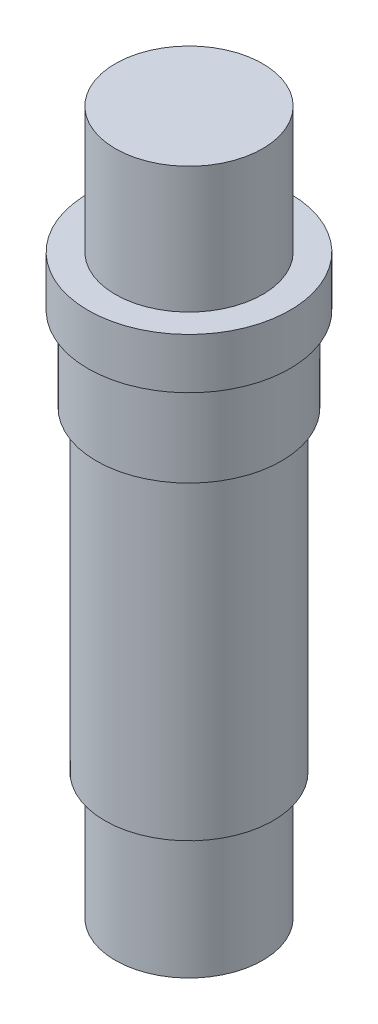
ISO-10303-21;
HEADER;
FILE_DESCRIPTION(('STEP AP214'),'2;1');
FILE_NAME('part.step','',(''),(''),'','','');
FILE_SCHEMA(('AUTOMOTIVE_DESIGN { 1 0 10303 214 1 1 1 1 }'));
ENDSEC;
DATA;
#1=APPLICATION_CONTEXT('core data for automotive mechanical design processes');
#2=APPLICATION_PROTOCOL_DEFINITION('international standard','automotive_design',2000,#1);
#3=PRODUCT_CONTEXT('',#1,'mechanical');
#4=PRODUCT('Part','Part','',(#3));
#5=PRODUCT_RELATED_PRODUCT_CATEGORY('part','',(#4));
#6=PRODUCT_DEFINITION_FORMATION('','',#4);
#7=PRODUCT_DEFINITION_CONTEXT('part definition',#1,'design');
#8=PRODUCT_DEFINITION('design','',#6,#7);
#9=PRODUCT_DEFINITION_SHAPE('','',#8);
#10=(LENGTH_UNIT() NAMED_UNIT(*) SI_UNIT(.MILLI.,.METRE.));
#11=(NAMED_UNIT(*) PLANE_ANGLE_UNIT() SI_UNIT($,.RADIAN.));
#12=(NAMED_UNIT(*) SI_UNIT($,.STERADIAN.) SOLID_ANGLE_UNIT());
#13=UNCERTAINTY_MEASURE_WITH_UNIT(LENGTH_MEASURE(1.E-05),#10,'distance_accuracy_value','');
#14=(GEOMETRIC_REPRESENTATION_CONTEXT(3) GLOBAL_UNCERTAINTY_ASSIGNED_CONTEXT((#13)) GLOBAL_UNIT_ASSIGNED_CONTEXT((#10,
#11,#12)) REPRESENTATION_CONTEXT('',''));
#15=CARTESIAN_POINT('',(0.,0.,0.));
#16=DIRECTION('',(0.,0.,1.));
#17=DIRECTION('',(1.,0.,0.));
#18=AXIS2_PLACEMENT_3D('',#15,#16,#17);
#19=CARTESIAN_POINT('',(0.,30.,0.));
#20=DIRECTION('',(0.,-1.,0.));
#21=DIRECTION('',(0.,0.,-1.));
#22=AXIS2_PLACEMENT_3D('',#19,#20,#21);
#23=CYLINDRICAL_SURFACE('',#22,17.5);
#24=CARTESIAN_POINT('',(0.,30.,0.));
#25=DIRECTION('',(0.,1.,0.));
#26=DIRECTION('',(0.,0.,1.));
#27=AXIS2_PLACEMENT_3D('',#24,#25,#26);
#28=CIRCLE('',#27,17.5);
#29=CARTESIAN_POINT('',(0.,30.,17.5));
#30=VERTEX_POINT('',#29);
#31=EDGE_CURVE('E38',#30,#30,#28,.T.);
#32=ORIENTED_EDGE('',*,*,#31,.F.);
#33=EDGE_LOOP('',(#32));
#34=FACE_BOUND('',#33,.T.);
#35=CARTESIAN_POINT('',(0.,0.,0.));
#36=DIRECTION('',(0.,1.,0.));
#37=DIRECTION('',(0.,0.,1.));
#38=AXIS2_PLACEMENT_3D('',#35,#36,#37);
#39=CIRCLE('',#38,17.5);
#40=CARTESIAN_POINT('',(0.,0.,17.5));
#41=VERTEX_POINT('',#40);
#42=EDGE_CURVE('E34',#41,#41,#39,.T.);
#43=ORIENTED_EDGE('',*,*,#42,.T.);
#44=EDGE_LOOP('',(#43));
#45=FACE_BOUND('',#44,.T.);
#46=ADVANCED_FACE('F31',(#34,#45),#23,.T.);
#47=CARTESIAN_POINT('',(0.,0.,0.));
#48=DIRECTION('',(0.,1.,0.));
#49=DIRECTION('',(0.,0.,1.));
#50=AXIS2_PLACEMENT_3D('',#47,#48,#49);
#51=PLANE('',#50);
#52=ORIENTED_EDGE('',*,*,#42,.F.);
#53=EDGE_LOOP('',(#52));
#54=FACE_BOUND('',#53,.T.);
#55=ADVANCED_FACE('F79',(#54),#51,.F.);
#56=CARTESIAN_POINT('',(0.,105.,0.));
#57=DIRECTION('',(0.,-1.,0.));
#58=DIRECTION('',(0.,0.,-1.));
#59=AXIS2_PLACEMENT_3D('',#56,#57,#58);
#60=CYLINDRICAL_SURFACE('',#59,20.);
#61=CARTESIAN_POINT('',(0.,105.,0.));
#62=DIRECTION('',(0.,1.,0.));
#63=DIRECTION('',(0.,0.,1.));
#64=AXIS2_PLACEMENT_3D('',#61,#62,#63);
#65=CIRCLE('',#64,20.);
#66=CARTESIAN_POINT('',(0.,105.,20.));
#67=VERTEX_POINT('',#66);
#68=EDGE_CURVE('E59',#67,#67,#65,.T.);
#69=ORIENTED_EDGE('',*,*,#68,.F.);
#70=EDGE_LOOP('',(#69));
#71=FACE_BOUND('',#70,.T.);
#72=CARTESIAN_POINT('',(0.,30.,0.));
#73=DIRECTION('',(0.,1.,0.));
#74=DIRECTION('',(0.,0.,1.));
#75=AXIS2_PLACEMENT_3D('',#72,#73,#74);
#76=CIRCLE('',#75,20.);
#77=CARTESIAN_POINT('',(0.,30.,20.));
#78=VERTEX_POINT('',#77);
#79=EDGE_CURVE('E56',#78,#78,#76,.T.);
#80=ORIENTED_EDGE('',*,*,#79,.T.);
#81=EDGE_LOOP('',(#80));
#82=FACE_BOUND('',#81,.T.);
#83=ADVANCED_FACE('F65',(#71,#82),#60,.T.);
#84=CARTESIAN_POINT('',(0.,30.,0.));
#85=DIRECTION('',(0.,1.,0.));
#86=DIRECTION('',(0.,0.,1.));
#87=AXIS2_PLACEMENT_3D('',#84,#85,#86);
#88=PLANE('',#87);
#89=ORIENTED_EDGE('',*,*,#31,.T.);
#90=EDGE_LOOP('',(#89));
#91=FACE_BOUND('',#90,.T.);
#92=ORIENTED_EDGE('',*,*,#79,.F.);
#93=EDGE_LOOP('',(#92));
#94=FACE_BOUND('',#93,.T.);
#95=ADVANCED_FACE('F67',(#91,#94),#88,.F.);
#96=CARTESIAN_POINT('',(0.,125.,0.));
#97=DIRECTION('',(0.,-1.,0.));
#98=DIRECTION('',(0.,0.,-1.));
#99=AXIS2_PLACEMENT_3D('',#96,#97,#98);
#100=CYLINDRICAL_SURFACE('',#99,22.);
#101=CARTESIAN_POINT('',(0.,125.,0.));
#102=DIRECTION('',(0.,1.,0.));
#103=DIRECTION('',(0.,0.,1.));
#104=AXIS2_PLACEMENT_3D('',#101,#102,#103);
#105=CIRCLE('',#104,22.);
#106=CARTESIAN_POINT('',(0.,125.,22.));
#107=VERTEX_POINT('',#106);
#108=EDGE_CURVE('E53',#107,#107,#105,.T.);
#109=ORIENTED_EDGE('',*,*,#108,.F.);
#110=EDGE_LOOP('',(#109));
#111=FACE_BOUND('',#110,.T.);
#112=CARTESIAN_POINT('',(0.,105.,0.));
#113=DIRECTION('',(0.,1.,0.));
#114=DIRECTION('',(0.,0.,1.));
#115=AXIS2_PLACEMENT_3D('',#112,#113,#114);
#116=CIRCLE('',#115,22.);
#117=CARTESIAN_POINT('',(0.,105.,22.));
#118=VERTEX_POINT('',#117);
#119=EDGE_CURVE('E49',#118,#118,#116,.T.);
#120=ORIENTED_EDGE('',*,*,#119,.T.);
#121=EDGE_LOOP('',(#120));
#122=FACE_BOUND('',#121,.T.);
#123=ADVANCED_FACE('F69',(#111,#122),#100,.T.);
#124=CARTESIAN_POINT('',(0.,105.,0.));
#125=DIRECTION('',(0.,1.,0.));
#126=DIRECTION('',(0.,0.,1.));
#127=AXIS2_PLACEMENT_3D('',#124,#125,#126);
#128=PLANE('',#127);
#129=ORIENTED_EDGE('',*,*,#68,.T.);
#130=EDGE_LOOP('',(#129));
#131=FACE_BOUND('',#130,.T.);
#132=ORIENTED_EDGE('',*,*,#119,.F.);
#133=EDGE_LOOP('',(#132));
#134=FACE_BOUND('',#133,.T.);
#135=ADVANCED_FACE('F76',(#131,#134),#128,.F.);
#136=CARTESIAN_POINT('',(0.,137.,0.));
#137=DIRECTION('',(0.,-1.,0.));
#138=DIRECTION('',(0.,0.,-1.));
#139=AXIS2_PLACEMENT_3D('',#136,#137,#138);
#140=CYLINDRICAL_SURFACE('',#139,24.);
#141=CARTESIAN_POINT('',(0.,137.,0.));
#142=DIRECTION('',(0.,1.,0.));
#143=DIRECTION('',(0.,0.,1.));
#144=AXIS2_PLACEMENT_3D('',#141,#142,#143);
#145=CIRCLE('',#144,24.);
#146=CARTESIAN_POINT('',(0.,137.,24.));
#147=VERTEX_POINT('',#146);
#148=EDGE_CURVE('E46',#147,#147,#145,.T.);
#149=ORIENTED_EDGE('',*,*,#148,.F.);
#150=EDGE_LOOP('',(#149));
#151=FACE_BOUND('',#150,.T.);
#152=CARTESIAN_POINT('',(0.,125.,0.));
#153=DIRECTION('',(0.,1.,0.));
#154=DIRECTION('',(0.,0.,1.));
#155=AXIS2_PLACEMENT_3D('',#152,#153,#154);
#156=CIRCLE('',#155,24.);
#157=CARTESIAN_POINT('',(0.,125.,24.));
#158=VERTEX_POINT('',#157);
#159=EDGE_CURVE('E50',#158,#158,#156,.T.);
#160=ORIENTED_EDGE('',*,*,#159,.T.);
#161=EDGE_LOOP('',(#160));
#162=FACE_BOUND('',#161,.T.);
#163=ADVANCED_FACE('F117',(#151,#162),#140,.T.);
#164=CARTESIAN_POINT('',(0.,137.,0.));
#165=DIRECTION('',(0.,1.,0.));
#166=DIRECTION('',(0.,0.,1.));
#167=AXIS2_PLACEMENT_3D('',#164,#165,#166);
#168=PLANE('',#167);
#169=CARTESIAN_POINT('',(0.,137.,0.));
#170=DIRECTION('',(0.,1.,0.));
#171=DIRECTION('',(0.,0.,1.));
#172=AXIS2_PLACEMENT_3D('',#169,#170,#171);
#173=CIRCLE('',#172,17.5);
#174=CARTESIAN_POINT('',(0.,137.,17.5));
#175=VERTEX_POINT('',#174);
#176=EDGE_CURVE('E10',#175,#175,#173,.T.);
#177=ORIENTED_EDGE('',*,*,#176,.F.);
#178=EDGE_LOOP('',(#177));
#179=FACE_BOUND('',#178,.T.);
#180=ORIENTED_EDGE('',*,*,#148,.T.);
#181=EDGE_LOOP('',(#180));
#182=FACE_BOUND('',#181,.T.);
#183=ADVANCED_FACE('F127',(#179,#182),#168,.T.);
#184=CARTESIAN_POINT('',(0.,125.,0.));
#185=DIRECTION('',(0.,1.,0.));
#186=DIRECTION('',(0.,0.,1.));
#187=AXIS2_PLACEMENT_3D('',#184,#185,#186);
#188=PLANE('',#187);
#189=ORIENTED_EDGE('',*,*,#108,.T.);
#190=EDGE_LOOP('',(#189));
#191=FACE_BOUND('',#190,.T.);
#192=ORIENTED_EDGE('',*,*,#159,.F.);
#193=EDGE_LOOP('',(#192));
#194=FACE_BOUND('',#193,.T.);
#195=ADVANCED_FACE('F135',(#191,#194),#188,.F.);
#196=CARTESIAN_POINT('',(0.,167.,0.));
#197=DIRECTION('',(0.,-1.,0.));
#198=DIRECTION('',(0.,0.,-1.));
#199=AXIS2_PLACEMENT_3D('',#196,#197,#198);
#200=CYLINDRICAL_SURFACE('',#199,17.5);
#201=CARTESIAN_POINT('',(0.,167.,0.));
#202=DIRECTION('',(0.,1.,0.));
#203=DIRECTION('',(0.,0.,1.));
#204=AXIS2_PLACEMENT_3D('',#201,#202,#203);
#205=CIRCLE('',#204,17.5);
#206=CARTESIAN_POINT('',(0.,167.,17.5));
#207=VERTEX_POINT('',#206);
#208=EDGE_CURVE('E45',#207,#207,#205,.T.);
#209=ORIENTED_EDGE('',*,*,#208,.F.);
#210=EDGE_LOOP('',(#209));
#211=FACE_BOUND('',#210,.T.);
#212=ORIENTED_EDGE('',*,*,#176,.T.);
#213=EDGE_LOOP('',(#212));
#214=FACE_BOUND('',#213,.T.);
#215=ADVANCED_FACE('F140',(#211,#214),#200,.T.);
#216=CARTESIAN_POINT('',(0.,167.,0.));
#217=DIRECTION('',(0.,1.,0.));
#218=DIRECTION('',(0.,0.,1.));
#219=AXIS2_PLACEMENT_3D('',#216,#217,#218);
#220=PLANE('',#219);
#221=ORIENTED_EDGE('',*,*,#208,.T.);
#222=EDGE_LOOP('',(#221));
#223=FACE_BOUND('',#222,.T.);
#224=ADVANCED_FACE('F157',(#223),#220,.T.);
#225=CLOSED_SHELL('',(#46,#55,#83,#95,#123,#135,#163,#183,#195,#215,#224));
#226=MANIFOLD_SOLID_BREP('B2',#225);
#227=ADVANCED_BREP_SHAPE_REPRESENTATION('',(#18,#226),#14);
#228=SHAPE_DEFINITION_REPRESENTATION(#9,#227);
ENDSEC;
END-ISO-10303-21;
